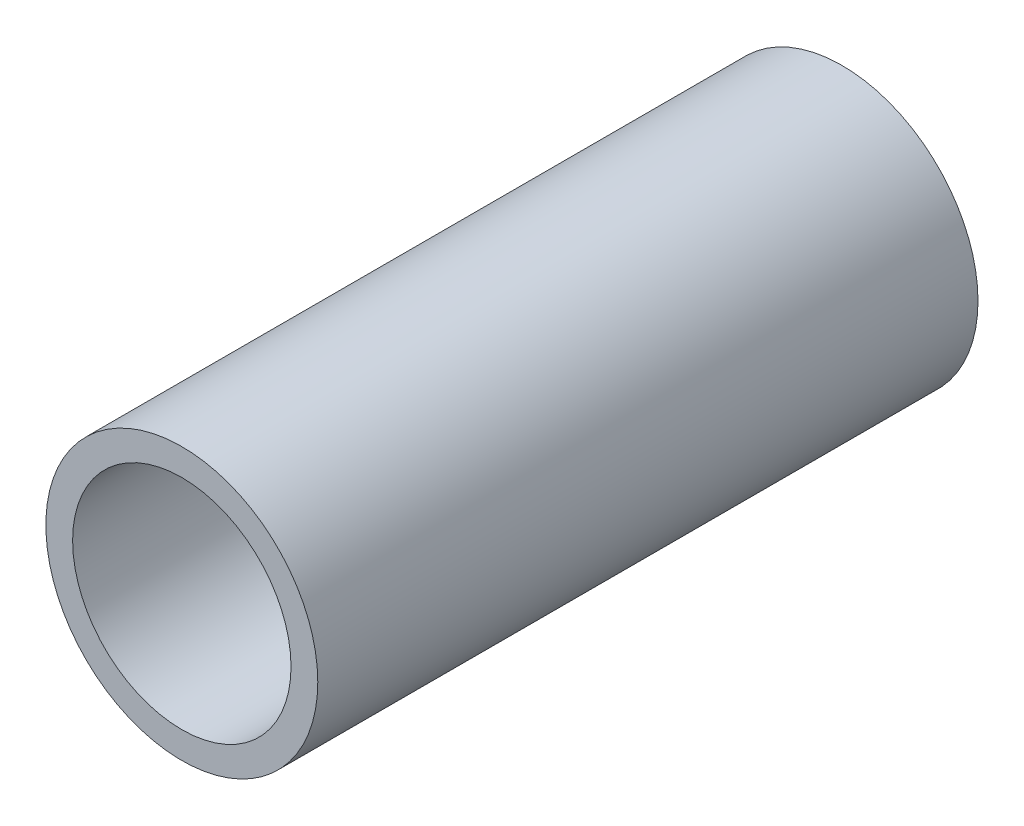
ISO-10303-21;
HEADER;
FILE_DESCRIPTION(('STEP AP214'),'2;1');
FILE_NAME('part.step','',(''),(''),'','','');
FILE_SCHEMA(('AUTOMOTIVE_DESIGN { 1 0 10303 214 1 1 1 1 }'));
ENDSEC;
DATA;
#1=APPLICATION_CONTEXT('core data for automotive mechanical design processes');
#2=APPLICATION_PROTOCOL_DEFINITION('international standard','automotive_design',2000,#1);
#3=PRODUCT_CONTEXT('',#1,'mechanical');
#4=PRODUCT('Part','Part','',(#3));
#5=PRODUCT_RELATED_PRODUCT_CATEGORY('part','',(#4));
#6=PRODUCT_DEFINITION_FORMATION('','',#4);
#7=PRODUCT_DEFINITION_CONTEXT('part definition',#1,'design');
#8=PRODUCT_DEFINITION('design','',#6,#7);
#9=PRODUCT_DEFINITION_SHAPE('','',#8);
#10=(LENGTH_UNIT() NAMED_UNIT(*) SI_UNIT(.MILLI.,.METRE.));
#11=(NAMED_UNIT(*) PLANE_ANGLE_UNIT() SI_UNIT($,.RADIAN.));
#12=(NAMED_UNIT(*) SI_UNIT($,.STERADIAN.) SOLID_ANGLE_UNIT());
#13=UNCERTAINTY_MEASURE_WITH_UNIT(LENGTH_MEASURE(1.E-05),#10,'distance_accuracy_value','');
#14=(GEOMETRIC_REPRESENTATION_CONTEXT(3) GLOBAL_UNCERTAINTY_ASSIGNED_CONTEXT((#13)) GLOBAL_UNIT_ASSIGNED_CONTEXT((#10,
#11,#12)) REPRESENTATION_CONTEXT('',''));
#15=CARTESIAN_POINT('',(0.,0.,0.));
#16=DIRECTION('',(0.,0.,1.));
#17=DIRECTION('',(1.,0.,0.));
#18=AXIS2_PLACEMENT_3D('',#15,#16,#17);
#19=CARTESIAN_POINT('',(0.,0.,46.25));
#20=DIRECTION('',(0.,0.,-1.));
#21=DIRECTION('',(-1.,0.,0.));
#22=AXIS2_PLACEMENT_3D('',#19,#20,#21);
#23=CYLINDRICAL_SURFACE('',#22,9.525);
#24=CARTESIAN_POINT('',(0.,0.,46.25));
#25=DIRECTION('',(0.,0.,1.));
#26=DIRECTION('',(1.,0.,0.));
#27=AXIS2_PLACEMENT_3D('',#24,#25,#26);
#28=CIRCLE('',#27,9.525);
#29=CARTESIAN_POINT('',(9.525,0.,46.25));
#30=VERTEX_POINT('',#29);
#31=EDGE_CURVE('E11',#30,#30,#28,.T.);
#32=ORIENTED_EDGE('',*,*,#31,.F.);
#33=EDGE_LOOP('',(#32));
#34=FACE_BOUND('',#33,.T.);
#35=CARTESIAN_POINT('',(0.,0.,0.));
#36=DIRECTION('',(0.,0.,1.));
#37=DIRECTION('',(1.,0.,0.));
#38=AXIS2_PLACEMENT_3D('',#35,#36,#37);
#39=CIRCLE('',#38,9.525);
#40=CARTESIAN_POINT('',(9.525,0.,0.));
#41=VERTEX_POINT('',#40);
#42=EDGE_CURVE('E62',#41,#41,#39,.T.);
#43=ORIENTED_EDGE('',*,*,#42,.T.);
#44=EDGE_LOOP('',(#43));
#45=FACE_BOUND('',#44,.T.);
#46=ADVANCED_FACE('F45',(#34,#45),#23,.T.);
#47=CARTESIAN_POINT('',(0.,0.,1.));
#48=DIRECTION('',(0.,0.,-1.));
#49=DIRECTION('',(-1.,0.,0.));
#50=AXIS2_PLACEMENT_3D('',#47,#48,#49);
#51=CYLINDRICAL_SURFACE('',#50,6.);
#52=CARTESIAN_POINT('',(0.,0.,1.));
#53=DIRECTION('',(0.,0.,-1.));
#54=DIRECTION('',(-1.,0.,0.));
#55=AXIS2_PLACEMENT_3D('',#52,#53,#54);
#56=CIRCLE('',#55,6.);
#57=CARTESIAN_POINT('',(-6.,0.,1.));
#58=VERTEX_POINT('',#57);
#59=EDGE_CURVE('E49',#58,#58,#56,.T.);
#60=ORIENTED_EDGE('',*,*,#59,.F.);
#61=EDGE_LOOP('',(#60));
#62=FACE_BOUND('',#61,.T.);
#63=CARTESIAN_POINT('',(0.,0.,0.));
#64=DIRECTION('',(0.,0.,-1.));
#65=DIRECTION('',(-1.,0.,0.));
#66=AXIS2_PLACEMENT_3D('',#63,#64,#65);
#67=CIRCLE('',#66,6.);
#68=CARTESIAN_POINT('',(-6.,0.,0.));
#69=VERTEX_POINT('',#68);
#70=EDGE_CURVE('E64',#69,#69,#67,.T.);
#71=ORIENTED_EDGE('',*,*,#70,.T.);
#72=EDGE_LOOP('',(#71));
#73=FACE_BOUND('',#72,.T.);
#74=ADVANCED_FACE('F47',(#62,#73),#51,.F.);
#75=CARTESIAN_POINT('',(0.,0.,0.));
#76=DIRECTION('',(0.,0.,1.));
#77=DIRECTION('',(1.,0.,0.));
#78=AXIS2_PLACEMENT_3D('',#75,#76,#77);
#79=PLANE('',#78);
#80=ORIENTED_EDGE('',*,*,#42,.F.);
#81=EDGE_LOOP('',(#80));
#82=FACE_BOUND('',#81,.T.);
#83=ORIENTED_EDGE('',*,*,#70,.F.);
#84=EDGE_LOOP('',(#83));
#85=FACE_BOUND('',#84,.T.);
#86=ADVANCED_FACE('F78',(#82,#85),#79,.F.);
#87=CARTESIAN_POINT('',(0.,0.,1.));
#88=DIRECTION('',(0.,0.,-1.));
#89=DIRECTION('',(-1.,0.,0.));
#90=AXIS2_PLACEMENT_3D('',#87,#88,#89);
#91=PLANE('',#90);
#92=ORIENTED_EDGE('',*,*,#59,.T.);
#93=EDGE_LOOP('',(#92));
#94=FACE_BOUND('',#93,.T.);
#95=CARTESIAN_POINT('',(0.,0.,1.));
#96=DIRECTION('',(0.,0.,-1.));
#97=DIRECTION('',(-1.,0.,0.));
#98=AXIS2_PLACEMENT_3D('',#95,#96,#97);
#99=CIRCLE('',#98,7.65);
#100=CARTESIAN_POINT('',(-7.65,0.,1.));
#101=VERTEX_POINT('',#100);
#102=EDGE_CURVE('E53',#101,#101,#99,.T.);
#103=ORIENTED_EDGE('',*,*,#102,.F.);
#104=EDGE_LOOP('',(#103));
#105=FACE_BOUND('',#104,.T.);
#106=ADVANCED_FACE('F74',(#94,#105),#91,.F.);
#107=CARTESIAN_POINT('',(0.,0.,46.25));
#108=DIRECTION('',(0.,0.,-1.));
#109=DIRECTION('',(-1.,0.,0.));
#110=AXIS2_PLACEMENT_3D('',#107,#108,#109);
#111=CYLINDRICAL_SURFACE('',#110,7.65);
#112=CARTESIAN_POINT('',(0.,0.,46.25));
#113=DIRECTION('',(0.,0.,1.));
#114=DIRECTION('',(1.,0.,0.));
#115=AXIS2_PLACEMENT_3D('',#112,#113,#114);
#116=CIRCLE('',#115,7.65);
#117=CARTESIAN_POINT('',(7.65,0.,46.25));
#118=VERTEX_POINT('',#117);
#119=EDGE_CURVE('E58',#118,#118,#116,.T.);
#120=ORIENTED_EDGE('',*,*,#119,.T.);
#121=EDGE_LOOP('',(#120));
#122=FACE_BOUND('',#121,.T.);
#123=ORIENTED_EDGE('',*,*,#102,.T.);
#124=EDGE_LOOP('',(#123));
#125=FACE_BOUND('',#124,.T.);
#126=ADVANCED_FACE('F93',(#122,#125),#111,.F.);
#127=CARTESIAN_POINT('',(0.,0.,46.25));
#128=DIRECTION('',(0.,0.,1.));
#129=DIRECTION('',(1.,0.,0.));
#130=AXIS2_PLACEMENT_3D('',#127,#128,#129);
#131=PLANE('',#130);
#132=ORIENTED_EDGE('',*,*,#31,.T.);
#133=EDGE_LOOP('',(#132));
#134=FACE_BOUND('',#133,.T.);
#135=ORIENTED_EDGE('',*,*,#119,.F.);
#136=EDGE_LOOP('',(#135));
#137=FACE_BOUND('',#136,.T.);
#138=ADVANCED_FACE('F90',(#134,#137),#131,.T.);
#139=CLOSED_SHELL('',(#46,#74,#86,#106,#126,#138));
#140=MANIFOLD_SOLID_BREP('B2',#139);
#141=ADVANCED_BREP_SHAPE_REPRESENTATION('',(#18,#140),#14);
#142=SHAPE_DEFINITION_REPRESENTATION(#9,#141);
ENDSEC;
END-ISO-10303-21;
